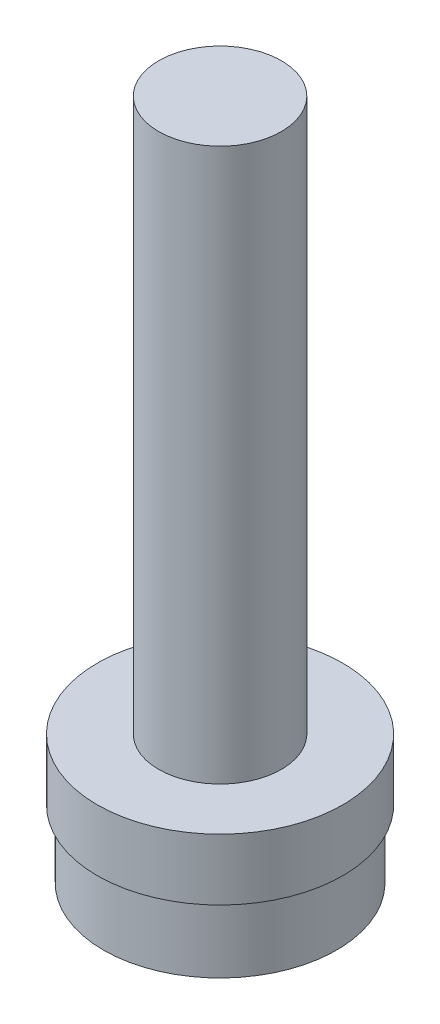
ISO-10303-21;
HEADER;
FILE_DESCRIPTION(('STEP AP214'),'2;1');
FILE_NAME('part.step','',(''),(''),'','','');
FILE_SCHEMA(('AUTOMOTIVE_DESIGN { 1 0 10303 214 1 1 1 1 }'));
ENDSEC;
DATA;
#1=APPLICATION_CONTEXT('core data for automotive mechanical design processes');
#2=APPLICATION_PROTOCOL_DEFINITION('international standard','automotive_design',2000,#1);
#3=PRODUCT_CONTEXT('',#1,'mechanical');
#4=PRODUCT('Part','Part','',(#3));
#5=PRODUCT_RELATED_PRODUCT_CATEGORY('part','',(#4));
#6=PRODUCT_DEFINITION_FORMATION('','',#4);
#7=PRODUCT_DEFINITION_CONTEXT('part definition',#1,'design');
#8=PRODUCT_DEFINITION('design','',#6,#7);
#9=PRODUCT_DEFINITION_SHAPE('','',#8);
#10=(LENGTH_UNIT() NAMED_UNIT(*) SI_UNIT(.MILLI.,.METRE.));
#11=(NAMED_UNIT(*) PLANE_ANGLE_UNIT() SI_UNIT($,.RADIAN.));
#12=(NAMED_UNIT(*) SI_UNIT($,.STERADIAN.) SOLID_ANGLE_UNIT());
#13=UNCERTAINTY_MEASURE_WITH_UNIT(LENGTH_MEASURE(1.E-05),#10,'distance_accuracy_value','');
#14=(GEOMETRIC_REPRESENTATION_CONTEXT(3) GLOBAL_UNCERTAINTY_ASSIGNED_CONTEXT((#13)) GLOBAL_UNIT_ASSIGNED_CONTEXT((#10,
#11,#12)) REPRESENTATION_CONTEXT('',''));
#15=CARTESIAN_POINT('',(0.,0.,0.));
#16=DIRECTION('',(0.,0.,1.));
#17=DIRECTION('',(1.,0.,0.));
#18=AXIS2_PLACEMENT_3D('',#15,#16,#17);
#19=CARTESIAN_POINT('',(0.,20.,0.));
#20=DIRECTION('',(0.,1.,0.));
#21=DIRECTION('',(1.,0.,0.));
#22=AXIS2_PLACEMENT_3D('',#19,#20,#21);
#23=PLANE('',#22);
#24=CARTESIAN_POINT('',(0.,20.,0.));
#25=DIRECTION('',(0.,1.,0.));
#26=DIRECTION('',(0.,0.,1.));
#27=AXIS2_PLACEMENT_3D('',#24,#25,#26);
#28=CIRCLE('',#27,2.);
#29=CARTESIAN_POINT('',(0.,20.,2.));
#30=VERTEX_POINT('',#29);
#31=EDGE_CURVE('E10',#30,#30,#28,.T.);
#32=ORIENTED_EDGE('',*,*,#31,.T.);
#33=EDGE_LOOP('',(#32));
#34=FACE_BOUND('',#33,.T.);
#35=ADVANCED_FACE('F15',(#34),#23,.T.);
#36=CARTESIAN_POINT('',(0.,0.,0.));
#37=DIRECTION('',(0.,1.,0.));
#38=DIRECTION('',(0.,0.,1.));
#39=AXIS2_PLACEMENT_3D('',#36,#37,#38);
#40=CYLINDRICAL_SURFACE('',#39,2.);
#41=ORIENTED_EDGE('',*,*,#31,.F.);
#42=EDGE_LOOP('',(#41));
#43=FACE_BOUND('',#42,.T.);
#44=CARTESIAN_POINT('',(0.,2.,0.));
#45=DIRECTION('',(0.,1.,0.));
#46=DIRECTION('',(0.,0.,1.));
#47=AXIS2_PLACEMENT_3D('',#44,#45,#46);
#48=CIRCLE('',#47,2.);
#49=CARTESIAN_POINT('',(0.,2.,2.));
#50=VERTEX_POINT('',#49);
#51=EDGE_CURVE('E18',#50,#50,#48,.T.);
#52=ORIENTED_EDGE('',*,*,#51,.T.);
#53=EDGE_LOOP('',(#52));
#54=FACE_BOUND('',#53,.T.);
#55=ADVANCED_FACE('F69',(#43,#54),#40,.T.);
#56=CARTESIAN_POINT('',(0.,2.,0.));
#57=DIRECTION('',(0.,1.,0.));
#58=DIRECTION('',(1.,0.,0.));
#59=AXIS2_PLACEMENT_3D('',#56,#57,#58);
#60=PLANE('',#59);
#61=ORIENTED_EDGE('',*,*,#51,.F.);
#62=EDGE_LOOP('',(#61));
#63=FACE_BOUND('',#62,.T.);
#64=CARTESIAN_POINT('',(0.,2.,0.));
#65=DIRECTION('',(0.,1.,0.));
#66=DIRECTION('',(0.,0.,1.));
#67=AXIS2_PLACEMENT_3D('',#64,#65,#66);
#68=CIRCLE('',#67,4.);
#69=CARTESIAN_POINT('',(0.,2.,4.));
#70=VERTEX_POINT('',#69);
#71=EDGE_CURVE('E32',#70,#70,#68,.T.);
#72=ORIENTED_EDGE('',*,*,#71,.T.);
#73=EDGE_LOOP('',(#72));
#74=FACE_BOUND('',#73,.T.);
#75=ADVANCED_FACE('F44',(#63,#74),#60,.T.);
#76=CARTESIAN_POINT('',(0.,0.,0.));
#77=DIRECTION('',(0.,1.,0.));
#78=DIRECTION('',(0.,0.,1.));
#79=AXIS2_PLACEMENT_3D('',#76,#77,#78);
#80=CYLINDRICAL_SURFACE('',#79,4.);
#81=ORIENTED_EDGE('',*,*,#71,.F.);
#82=EDGE_LOOP('',(#81));
#83=FACE_BOUND('',#82,.T.);
#84=CARTESIAN_POINT('',(0.,0.,0.));
#85=DIRECTION('',(0.,1.,0.));
#86=DIRECTION('',(0.,0.,1.));
#87=AXIS2_PLACEMENT_3D('',#84,#85,#86);
#88=CIRCLE('',#87,4.);
#89=CARTESIAN_POINT('',(0.,0.,4.));
#90=VERTEX_POINT('',#89);
#91=EDGE_CURVE('E37',#90,#90,#88,.T.);
#92=ORIENTED_EDGE('',*,*,#91,.T.);
#93=EDGE_LOOP('',(#92));
#94=FACE_BOUND('',#93,.T.);
#95=ADVANCED_FACE('F46',(#83,#94),#80,.T.);
#96=CARTESIAN_POINT('',(0.,-2.2,0.));
#97=DIRECTION('',(0.,1.,0.));
#98=DIRECTION('',(1.,0.,0.));
#99=AXIS2_PLACEMENT_3D('',#96,#97,#98);
#100=PLANE('',#99);
#101=CARTESIAN_POINT('',(0.,-2.2,0.));
#102=DIRECTION('',(0.,1.,0.));
#103=DIRECTION('',(0.,0.,1.));
#104=AXIS2_PLACEMENT_3D('',#101,#102,#103);
#105=CIRCLE('',#104,3.8);
#106=CARTESIAN_POINT('',(0.,-2.2,3.8));
#107=VERTEX_POINT('',#106);
#108=EDGE_CURVE('E35',#107,#107,#105,.T.);
#109=ORIENTED_EDGE('',*,*,#108,.F.);
#110=EDGE_LOOP('',(#109));
#111=FACE_BOUND('',#110,.T.);
#112=ADVANCED_FACE('F49',(#111),#100,.F.);
#113=CARTESIAN_POINT('',(0.,0.,0.));
#114=DIRECTION('',(0.,1.,0.));
#115=DIRECTION('',(1.,0.,0.));
#116=AXIS2_PLACEMENT_3D('',#113,#114,#115);
#117=PLANE('',#116);
#118=CARTESIAN_POINT('',(0.,0.,0.));
#119=DIRECTION('',(0.,1.,0.));
#120=DIRECTION('',(0.,0.,1.));
#121=AXIS2_PLACEMENT_3D('',#118,#119,#120);
#122=CIRCLE('',#121,3.8);
#123=CARTESIAN_POINT('',(0.,0.,3.8));
#124=VERTEX_POINT('',#123);
#125=EDGE_CURVE('E195',#124,#124,#122,.T.);
#126=ORIENTED_EDGE('',*,*,#125,.T.);
#127=EDGE_LOOP('',(#126));
#128=FACE_BOUND('',#127,.T.);
#129=ORIENTED_EDGE('',*,*,#91,.F.);
#130=EDGE_LOOP('',(#129));
#131=FACE_BOUND('',#130,.T.);
#132=ADVANCED_FACE('F53',(#128,#131),#117,.F.);
#133=CARTESIAN_POINT('',(0.,-2.2,0.));
#134=DIRECTION('',(0.,1.,0.));
#135=DIRECTION('',(0.,0.,1.));
#136=AXIS2_PLACEMENT_3D('',#133,#134,#135);
#137=CYLINDRICAL_SURFACE('',#136,3.8);
#138=ORIENTED_EDGE('',*,*,#125,.F.);
#139=EDGE_LOOP('',(#138));
#140=FACE_BOUND('',#139,.T.);
#141=ORIENTED_EDGE('',*,*,#108,.T.);
#142=EDGE_LOOP('',(#141));
#143=FACE_BOUND('',#142,.T.);
#144=ADVANCED_FACE('F55',(#140,#143),#137,.T.);
#145=CLOSED_SHELL('',(#35,#55,#75,#95,#112,#132,#144));
#146=MANIFOLD_SOLID_BREP('B1',#145);
#147=ADVANCED_BREP_SHAPE_REPRESENTATION('',(#18,#146),#14);
#148=SHAPE_DEFINITION_REPRESENTATION(#9,#147);
ENDSEC;
END-ISO-10303-21;
